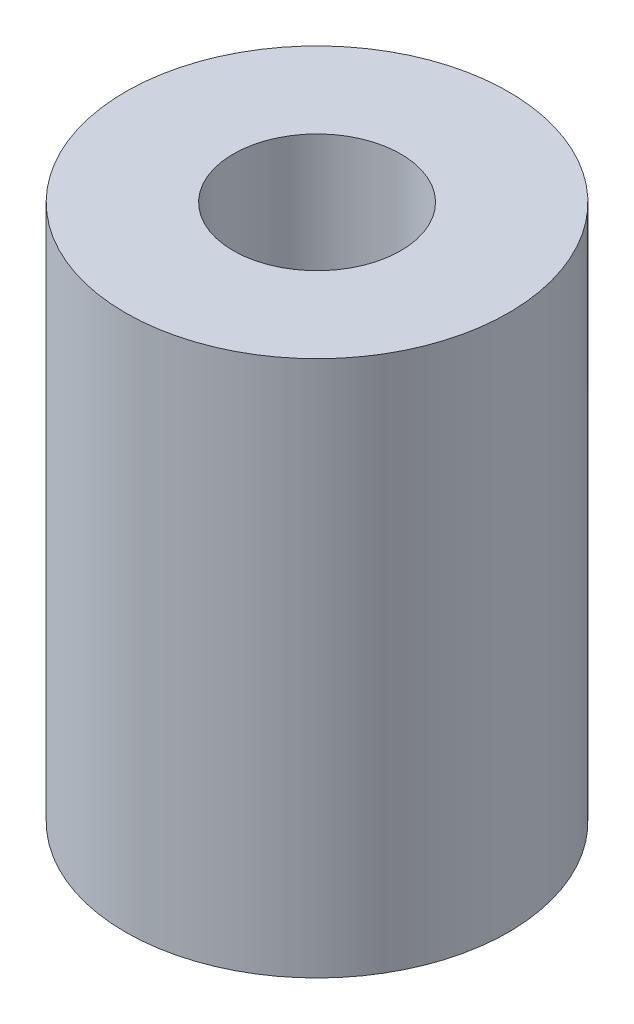
ISO-10303-21;
HEADER;
FILE_DESCRIPTION(('STEP AP214'),'2;1');
FILE_NAME('part.step','',(''),(''),'','','');
FILE_SCHEMA(('AUTOMOTIVE_DESIGN { 1 0 10303 214 1 1 1 1 }'));
ENDSEC;
DATA;
#1=APPLICATION_CONTEXT('core data for automotive mechanical design processes');
#2=APPLICATION_PROTOCOL_DEFINITION('international standard','automotive_design',2000,#1);
#3=PRODUCT_CONTEXT('',#1,'mechanical');
#4=PRODUCT('Part','Part','',(#3));
#5=PRODUCT_RELATED_PRODUCT_CATEGORY('part','',(#4));
#6=PRODUCT_DEFINITION_FORMATION('','',#4);
#7=PRODUCT_DEFINITION_CONTEXT('part definition',#1,'design');
#8=PRODUCT_DEFINITION('design','',#6,#7);
#9=PRODUCT_DEFINITION_SHAPE('','',#8);
#10=(LENGTH_UNIT() NAMED_UNIT(*) SI_UNIT(.MILLI.,.METRE.));
#11=(NAMED_UNIT(*) PLANE_ANGLE_UNIT() SI_UNIT($,.RADIAN.));
#12=(NAMED_UNIT(*) SI_UNIT($,.STERADIAN.) SOLID_ANGLE_UNIT());
#13=UNCERTAINTY_MEASURE_WITH_UNIT(LENGTH_MEASURE(1.E-05),#10,'distance_accuracy_value','');
#14=(GEOMETRIC_REPRESENTATION_CONTEXT(3) GLOBAL_UNCERTAINTY_ASSIGNED_CONTEXT((#13)) GLOBAL_UNIT_ASSIGNED_CONTEXT((#10,
#11,#12)) REPRESENTATION_CONTEXT('',''));
#15=CARTESIAN_POINT('',(0.,0.,0.));
#16=DIRECTION('',(0.,0.,1.));
#17=DIRECTION('',(1.,0.,0.));
#18=AXIS2_PLACEMENT_3D('',#15,#16,#17);
#19=CARTESIAN_POINT('',(0.,11.2,0.));
#20=DIRECTION('',(0.,1.,0.));
#21=DIRECTION('',(0.,0.,1.));
#22=AXIS2_PLACEMENT_3D('',#19,#20,#21);
#23=PLANE('',#22);
#24=CARTESIAN_POINT('',(0.,11.2,0.));
#25=DIRECTION('',(0.,1.,0.));
#26=DIRECTION('',(0.,0.,1.));
#27=AXIS2_PLACEMENT_3D('',#24,#25,#26);
#28=CIRCLE('',#27,4.);
#29=CARTESIAN_POINT('',(0.,11.2,4.));
#30=VERTEX_POINT('',#29);
#31=EDGE_CURVE('E10',#30,#30,#28,.T.);
#32=ORIENTED_EDGE('',*,*,#31,.T.);
#33=EDGE_LOOP('',(#32));
#34=FACE_BOUND('',#33,.T.);
#35=CARTESIAN_POINT('',(0.,11.2,0.));
#36=DIRECTION('',(0.,1.,0.));
#37=DIRECTION('',(0.,0.,1.));
#38=AXIS2_PLACEMENT_3D('',#35,#36,#37);
#39=CIRCLE('',#38,1.75);
#40=CARTESIAN_POINT('',(0.,11.2,1.75));
#41=VERTEX_POINT('',#40);
#42=EDGE_CURVE('E56',#41,#41,#39,.T.);
#43=ORIENTED_EDGE('',*,*,#42,.F.);
#44=EDGE_LOOP('',(#43));
#45=FACE_BOUND('',#44,.T.);
#46=ADVANCED_FACE('F43',(#34,#45),#23,.T.);
#47=CARTESIAN_POINT('',(0.,0.,0.));
#48=DIRECTION('',(0.,1.,0.));
#49=DIRECTION('',(0.,0.,1.));
#50=AXIS2_PLACEMENT_3D('',#47,#48,#49);
#51=PLANE('',#50);
#52=CARTESIAN_POINT('',(0.,0.,0.));
#53=DIRECTION('',(0.,1.,0.));
#54=DIRECTION('',(0.,0.,1.));
#55=AXIS2_PLACEMENT_3D('',#52,#53,#54);
#56=CIRCLE('',#55,4.);
#57=CARTESIAN_POINT('',(0.,0.,4.));
#58=VERTEX_POINT('',#57);
#59=EDGE_CURVE('E47',#58,#58,#56,.T.);
#60=ORIENTED_EDGE('',*,*,#59,.F.);
#61=EDGE_LOOP('',(#60));
#62=FACE_BOUND('',#61,.T.);
#63=CARTESIAN_POINT('',(0.,0.,0.));
#64=DIRECTION('',(0.,1.,0.));
#65=DIRECTION('',(0.,0.,1.));
#66=AXIS2_PLACEMENT_3D('',#63,#64,#65);
#67=CIRCLE('',#66,1.75);
#68=CARTESIAN_POINT('',(0.,0.,1.75));
#69=VERTEX_POINT('',#68);
#70=EDGE_CURVE('E58',#69,#69,#67,.T.);
#71=ORIENTED_EDGE('',*,*,#70,.T.);
#72=EDGE_LOOP('',(#71));
#73=FACE_BOUND('',#72,.T.);
#74=ADVANCED_FACE('F70',(#62,#73),#51,.F.);
#75=CARTESIAN_POINT('',(0.,11.2,0.));
#76=DIRECTION('',(0.,-1.,0.));
#77=DIRECTION('',(0.,0.,-1.));
#78=AXIS2_PLACEMENT_3D('',#75,#76,#77);
#79=CYLINDRICAL_SURFACE('',#78,4.);
#80=ORIENTED_EDGE('',*,*,#31,.F.);
#81=EDGE_LOOP('',(#80));
#82=FACE_BOUND('',#81,.T.);
#83=ORIENTED_EDGE('',*,*,#59,.T.);
#84=EDGE_LOOP('',(#83));
#85=FACE_BOUND('',#84,.T.);
#86=ADVANCED_FACE('F45',(#82,#85),#79,.T.);
#87=CARTESIAN_POINT('',(0.,11.2,0.));
#88=DIRECTION('',(0.,-1.,0.));
#89=DIRECTION('',(0.,0.,-1.));
#90=AXIS2_PLACEMENT_3D('',#87,#88,#89);
#91=CYLINDRICAL_SURFACE('',#90,1.75);
#92=ORIENTED_EDGE('',*,*,#42,.T.);
#93=EDGE_LOOP('',(#92));
#94=FACE_BOUND('',#93,.T.);
#95=ORIENTED_EDGE('',*,*,#70,.F.);
#96=EDGE_LOOP('',(#95));
#97=FACE_BOUND('',#96,.T.);
#98=ADVANCED_FACE('F66',(#94,#97),#91,.F.);
#99=CLOSED_SHELL('',(#46,#74,#86,#98));
#100=MANIFOLD_SOLID_BREP('B2',#99);
#101=ADVANCED_BREP_SHAPE_REPRESENTATION('',(#18,#100),#14);
#102=SHAPE_DEFINITION_REPRESENTATION(#9,#101);
ENDSEC;
END-ISO-10303-21;
